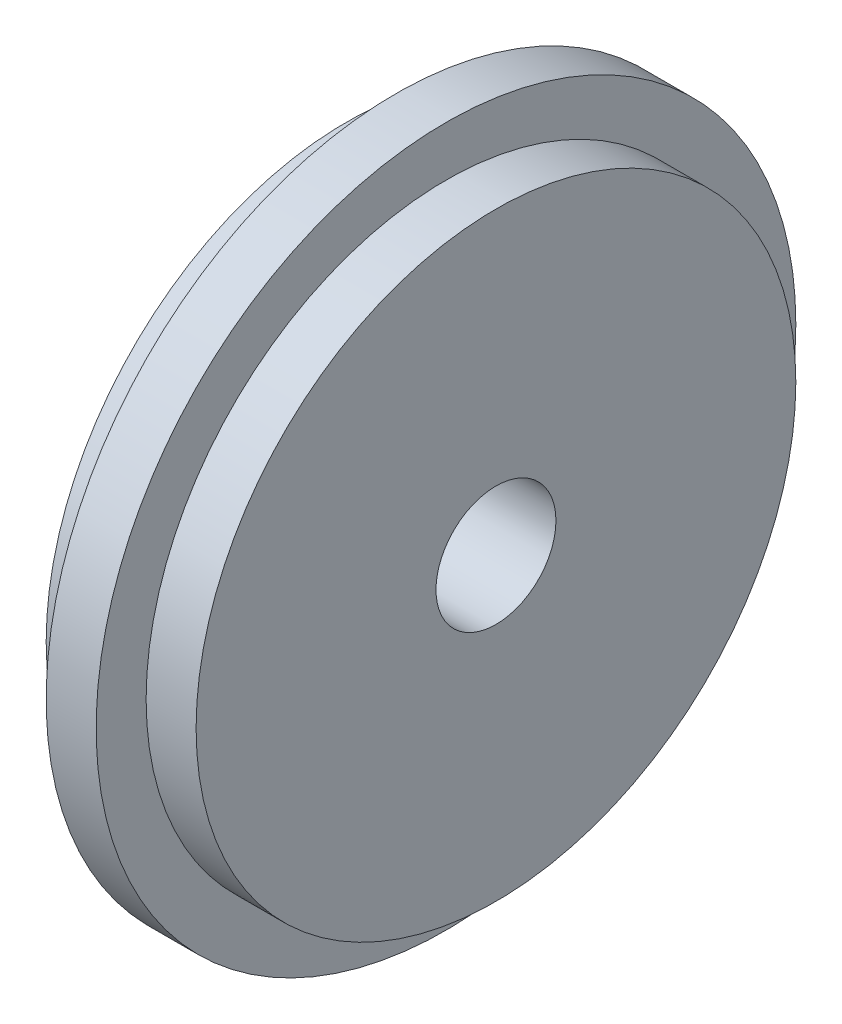
ISO-10303-21;
HEADER;
FILE_DESCRIPTION(('STEP AP214'),'2;1');
FILE_NAME('part.step','',(''),(''),'','','');
FILE_SCHEMA(('AUTOMOTIVE_DESIGN { 1 0 10303 214 1 1 1 1 }'));
ENDSEC;
DATA;
#1=APPLICATION_CONTEXT('core data for automotive mechanical design processes');
#2=APPLICATION_PROTOCOL_DEFINITION('international standard','automotive_design',2000,#1);
#3=PRODUCT_CONTEXT('',#1,'mechanical');
#4=PRODUCT('Part','Part','',(#3));
#5=PRODUCT_RELATED_PRODUCT_CATEGORY('part','',(#4));
#6=PRODUCT_DEFINITION_FORMATION('','',#4);
#7=PRODUCT_DEFINITION_CONTEXT('part definition',#1,'design');
#8=PRODUCT_DEFINITION('design','',#6,#7);
#9=PRODUCT_DEFINITION_SHAPE('','',#8);
#10=(LENGTH_UNIT() NAMED_UNIT(*) SI_UNIT(.MILLI.,.METRE.));
#11=(NAMED_UNIT(*) PLANE_ANGLE_UNIT() SI_UNIT($,.RADIAN.));
#12=(NAMED_UNIT(*) SI_UNIT($,.STERADIAN.) SOLID_ANGLE_UNIT());
#13=UNCERTAINTY_MEASURE_WITH_UNIT(LENGTH_MEASURE(1.E-05),#10,'distance_accuracy_value','');
#14=(GEOMETRIC_REPRESENTATION_CONTEXT(3) GLOBAL_UNCERTAINTY_ASSIGNED_CONTEXT((#13)) GLOBAL_UNIT_ASSIGNED_CONTEXT((#10,
#11,#12)) REPRESENTATION_CONTEXT('',''));
#15=CARTESIAN_POINT('',(0.,0.,0.));
#16=DIRECTION('',(0.,0.,1.));
#17=DIRECTION('',(1.,0.,0.));
#18=AXIS2_PLACEMENT_3D('',#15,#16,#17);
#19=CARTESIAN_POINT('',(7.5,0.,0.));
#20=DIRECTION('',(-1.,0.,0.));
#21=DIRECTION('',(0.,0.,1.));
#22=AXIS2_PLACEMENT_3D('',#19,#20,#21);
#23=CYLINDRICAL_SURFACE('',#22,30.);
#24=CARTESIAN_POINT('',(2.5,0.,0.));
#25=DIRECTION('',(1.,0.,0.));
#26=DIRECTION('',(0.,0.,-1.));
#27=AXIS2_PLACEMENT_3D('',#24,#25,#26);
#28=CIRCLE('',#27,30.);
#29=CARTESIAN_POINT('',(2.5,0.,-30.));
#30=VERTEX_POINT('',#29);
#31=EDGE_CURVE('E35',#30,#30,#28,.T.);
#32=ORIENTED_EDGE('',*,*,#31,.T.);
#33=EDGE_LOOP('',(#32));
#34=FACE_BOUND('',#33,.T.);
#35=CARTESIAN_POINT('',(7.5,0.,0.));
#36=DIRECTION('',(1.,0.,0.));
#37=DIRECTION('',(0.,0.,-1.));
#38=AXIS2_PLACEMENT_3D('',#35,#36,#37);
#39=CIRCLE('',#38,30.);
#40=CARTESIAN_POINT('',(7.5,0.,-30.));
#41=VERTEX_POINT('',#40);
#42=EDGE_CURVE('E39',#41,#41,#39,.T.);
#43=ORIENTED_EDGE('',*,*,#42,.F.);
#44=EDGE_LOOP('',(#43));
#45=FACE_BOUND('',#44,.T.);
#46=ADVANCED_FACE('F32',(#34,#45),#23,.T.);
#47=CARTESIAN_POINT('',(7.5,0.,0.));
#48=DIRECTION('',(1.,0.,0.));
#49=DIRECTION('',(0.,0.,-1.));
#50=AXIS2_PLACEMENT_3D('',#47,#48,#49);
#51=PLANE('',#50);
#52=CARTESIAN_POINT('',(7.5,0.,0.));
#53=DIRECTION('',(1.,0.,0.));
#54=DIRECTION('',(0.,0.,-1.));
#55=AXIS2_PLACEMENT_3D('',#52,#53,#54);
#56=CIRCLE('',#55,6.);
#57=CARTESIAN_POINT('',(7.5,0.,-6.));
#58=VERTEX_POINT('',#57);
#59=EDGE_CURVE('E57',#58,#58,#56,.T.);
#60=ORIENTED_EDGE('',*,*,#59,.F.);
#61=EDGE_LOOP('',(#60));
#62=FACE_BOUND('',#61,.T.);
#63=ORIENTED_EDGE('',*,*,#42,.T.);
#64=EDGE_LOOP('',(#63));
#65=FACE_BOUND('',#64,.T.);
#66=ADVANCED_FACE('F63',(#62,#65),#51,.T.);
#67=CARTESIAN_POINT('',(2.5,0.,0.));
#68=DIRECTION('',(1.,0.,0.));
#69=DIRECTION('',(0.,0.,-1.));
#70=AXIS2_PLACEMENT_3D('',#67,#68,#69);
#71=PLANE('',#70);
#72=CARTESIAN_POINT('',(2.5,0.,0.));
#73=DIRECTION('',(1.,0.,0.));
#74=DIRECTION('',(0.,0.,-1.));
#75=AXIS2_PLACEMENT_3D('',#72,#73,#74);
#76=CIRCLE('',#75,35.);
#77=CARTESIAN_POINT('',(2.5,0.,-35.));
#78=VERTEX_POINT('',#77);
#79=EDGE_CURVE('E51',#78,#78,#76,.T.);
#80=ORIENTED_EDGE('',*,*,#79,.T.);
#81=EDGE_LOOP('',(#80));
#82=FACE_BOUND('',#81,.T.);
#83=ORIENTED_EDGE('',*,*,#31,.F.);
#84=EDGE_LOOP('',(#83));
#85=FACE_BOUND('',#84,.T.);
#86=ADVANCED_FACE('F66',(#82,#85),#71,.T.);
#87=CARTESIAN_POINT('',(-2.5,0.,0.));
#88=DIRECTION('',(1.,0.,0.));
#89=DIRECTION('',(0.,0.,-1.));
#90=AXIS2_PLACEMENT_3D('',#87,#88,#89);
#91=PLANE('',#90);
#92=CARTESIAN_POINT('',(-2.5,0.,0.));
#93=DIRECTION('',(1.,0.,0.));
#94=DIRECTION('',(0.,0.,-1.));
#95=AXIS2_PLACEMENT_3D('',#92,#93,#94);
#96=CIRCLE('',#95,35.);
#97=CARTESIAN_POINT('',(-2.5,0.,-35.));
#98=VERTEX_POINT('',#97);
#99=EDGE_CURVE('E48',#98,#98,#96,.T.);
#100=ORIENTED_EDGE('',*,*,#99,.F.);
#101=EDGE_LOOP('',(#100));
#102=FACE_BOUND('',#101,.T.);
#103=CARTESIAN_POINT('',(-2.5,0.,0.));
#104=DIRECTION('',(1.,0.,0.));
#105=DIRECTION('',(0.,0.,-1.));
#106=AXIS2_PLACEMENT_3D('',#103,#104,#105);
#107=CIRCLE('',#106,30.);
#108=CARTESIAN_POINT('',(-2.5,0.,-30.));
#109=VERTEX_POINT('',#108);
#110=EDGE_CURVE('E10',#109,#109,#107,.T.);
#111=ORIENTED_EDGE('',*,*,#110,.T.);
#112=EDGE_LOOP('',(#111));
#113=FACE_BOUND('',#112,.T.);
#114=ADVANCED_FACE('F93',(#102,#113),#91,.F.);
#115=CARTESIAN_POINT('',(2.5,0.,0.));
#116=DIRECTION('',(-1.,0.,0.));
#117=DIRECTION('',(0.,0.,1.));
#118=AXIS2_PLACEMENT_3D('',#115,#116,#117);
#119=CYLINDRICAL_SURFACE('',#118,35.);
#120=ORIENTED_EDGE('',*,*,#79,.F.);
#121=EDGE_LOOP('',(#120));
#122=FACE_BOUND('',#121,.T.);
#123=ORIENTED_EDGE('',*,*,#99,.T.);
#124=EDGE_LOOP('',(#123));
#125=FACE_BOUND('',#124,.T.);
#126=ADVANCED_FACE('F85',(#122,#125),#119,.T.);
#127=CARTESIAN_POINT('',(-7.5,0.,0.));
#128=DIRECTION('',(1.,0.,0.));
#129=DIRECTION('',(0.,0.,-1.));
#130=AXIS2_PLACEMENT_3D('',#127,#128,#129);
#131=PLANE('',#130);
#132=CARTESIAN_POINT('',(-7.5,0.,0.));
#133=DIRECTION('',(1.,0.,0.));
#134=DIRECTION('',(0.,0.,-1.));
#135=AXIS2_PLACEMENT_3D('',#132,#133,#134);
#136=CIRCLE('',#135,6.);
#137=CARTESIAN_POINT('',(-7.5,0.,-6.));
#138=VERTEX_POINT('',#137);
#139=EDGE_CURVE('E52',#138,#138,#136,.T.);
#140=ORIENTED_EDGE('',*,*,#139,.T.);
#141=EDGE_LOOP('',(#140));
#142=FACE_BOUND('',#141,.T.);
#143=CARTESIAN_POINT('',(-7.5,0.,0.));
#144=DIRECTION('',(1.,0.,0.));
#145=DIRECTION('',(0.,0.,-1.));
#146=AXIS2_PLACEMENT_3D('',#143,#144,#145);
#147=CIRCLE('',#146,30.);
#148=CARTESIAN_POINT('',(-7.5,0.,-30.));
#149=VERTEX_POINT('',#148);
#150=EDGE_CURVE('E43',#149,#149,#147,.T.);
#151=ORIENTED_EDGE('',*,*,#150,.F.);
#152=EDGE_LOOP('',(#151));
#153=FACE_BOUND('',#152,.T.);
#154=ADVANCED_FACE('F77',(#142,#153),#131,.F.);
#155=ORIENTED_EDGE('',*,*,#150,.T.);
#156=EDGE_LOOP('',(#155));
#157=FACE_BOUND('',#156,.T.);
#158=ORIENTED_EDGE('',*,*,#110,.F.);
#159=EDGE_LOOP('',(#158));
#160=FACE_BOUND('',#159,.T.);
#161=ADVANCED_FACE('F72',(#157,#160),#23,.T.);
#162=CARTESIAN_POINT('',(7.5,0.,0.));
#163=DIRECTION('',(1.,0.,0.));
#164=DIRECTION('',(0.,0.,-1.));
#165=AXIS2_PLACEMENT_3D('',#162,#163,#164);
#166=CYLINDRICAL_SURFACE('',#165,6.);
#167=ORIENTED_EDGE('',*,*,#139,.F.);
#168=EDGE_LOOP('',(#167));
#169=FACE_BOUND('',#168,.T.);
#170=ORIENTED_EDGE('',*,*,#59,.T.);
#171=EDGE_LOOP('',(#170));
#172=FACE_BOUND('',#171,.T.);
#173=ADVANCED_FACE('F61',(#169,#172),#166,.F.);
#174=CLOSED_SHELL('',(#46,#66,#86,#114,#126,#154,#161,#173));
#175=MANIFOLD_SOLID_BREP('B2',#174);
#176=ADVANCED_BREP_SHAPE_REPRESENTATION('',(#18,#175),#14);
#177=SHAPE_DEFINITION_REPRESENTATION(#9,#176);
ENDSEC;
END-ISO-10303-21;
